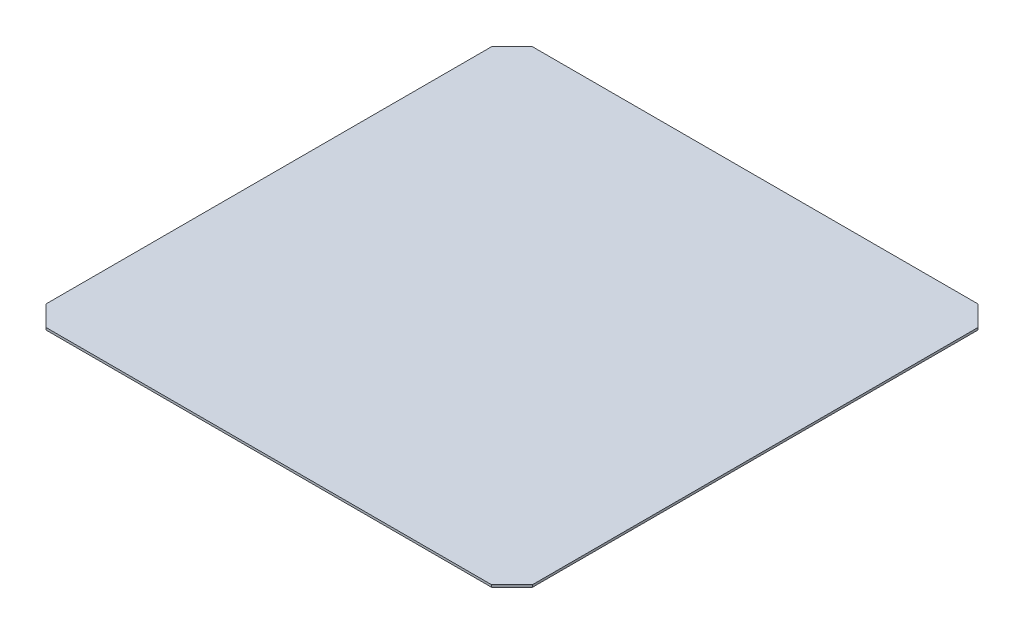
ISO-10303-21;
HEADER;
FILE_DESCRIPTION(('STEP AP214'),'2;1');
FILE_NAME('part.step','',(''),(''),'','','');
FILE_SCHEMA(('AUTOMOTIVE_DESIGN { 1 0 10303 214 1 1 1 1 }'));
ENDSEC;
DATA;
#1=APPLICATION_CONTEXT('core data for automotive mechanical design processes');
#2=APPLICATION_PROTOCOL_DEFINITION('international standard','automotive_design',2000,#1);
#3=PRODUCT_CONTEXT('',#1,'mechanical');
#4=PRODUCT('Part','Part','',(#3));
#5=PRODUCT_RELATED_PRODUCT_CATEGORY('part','',(#4));
#6=PRODUCT_DEFINITION_FORMATION('','',#4);
#7=PRODUCT_DEFINITION_CONTEXT('part definition',#1,'design');
#8=PRODUCT_DEFINITION('design','',#6,#7);
#9=PRODUCT_DEFINITION_SHAPE('','',#8);
#10=(LENGTH_UNIT() NAMED_UNIT(*) SI_UNIT(.MILLI.,.METRE.));
#11=(NAMED_UNIT(*) PLANE_ANGLE_UNIT() SI_UNIT($,.RADIAN.));
#12=(NAMED_UNIT(*) SI_UNIT($,.STERADIAN.) SOLID_ANGLE_UNIT());
#13=UNCERTAINTY_MEASURE_WITH_UNIT(LENGTH_MEASURE(1.E-05),#10,'distance_accuracy_value','');
#14=(GEOMETRIC_REPRESENTATION_CONTEXT(3) GLOBAL_UNCERTAINTY_ASSIGNED_CONTEXT((#13)) GLOBAL_UNIT_ASSIGNED_CONTEXT((#10,
#11,#12)) REPRESENTATION_CONTEXT('',''));
#15=CARTESIAN_POINT('',(0.,0.,0.));
#16=DIRECTION('',(0.,0.,1.));
#17=DIRECTION('',(1.,0.,0.));
#18=AXIS2_PLACEMENT_3D('',#15,#16,#17);
#19=CARTESIAN_POINT('',(191.936218840519,159.973467120901,354.11857786968));
#20=DIRECTION('',(0.,0.,-1.));
#21=DIRECTION('',(-1.,0.,0.));
#22=AXIS2_PLACEMENT_3D('',#19,#20,#21);
#23=PLANE('',#22);
#24=DIRECTION('',(1.,0.,0.));
#25=VECTOR('',#24,1.);
#26=CARTESIAN_POINT('',(191.936218840519,158.973467120901,354.11857786968));
#27=LINE('',#26,#25);
#28=CARTESIAN_POINT('',(-8.06378115948106,158.973467120901,354.11857786968));
#29=VERTEX_POINT('',#28);
#30=CARTESIAN_POINT('',(188.936218840519,158.973467120901,354.11857786968));
#31=VERTEX_POINT('',#30);
#32=EDGE_CURVE('E131',#29,#31,#27,.T.);
#33=ORIENTED_EDGE('',*,*,#32,.T.);
#34=DIRECTION('',(0.,1.,0.));
#35=VECTOR('',#34,1.);
#36=CARTESIAN_POINT('',(188.936218840519,159.973467120901,354.11857786968));
#37=LINE('',#36,#35);
#38=CARTESIAN_POINT('',(188.936218840519,159.973467120901,354.11857786968));
#39=VERTEX_POINT('',#38);
#40=EDGE_CURVE('E154',#31,#39,#37,.T.);
#41=ORIENTED_EDGE('',*,*,#40,.T.);
#42=DIRECTION('',(1.,0.,0.));
#43=VECTOR('',#42,1.);
#44=CARTESIAN_POINT('',(-17.0637811594811,159.973467120901,354.11857786968));
#45=LINE('',#44,#43);
#46=CARTESIAN_POINT('',(-8.06378115948106,159.973467120901,354.11857786968));
#47=VERTEX_POINT('',#46);
#48=EDGE_CURVE('E129',#47,#39,#45,.T.);
#49=ORIENTED_EDGE('',*,*,#48,.F.);
#50=DIRECTION('',(0.,-1.,0.));
#51=VECTOR('',#50,1.);
#52=CARTESIAN_POINT('',(-8.06378115948106,159.973467120901,354.11857786968));
#53=LINE('',#52,#51);
#54=EDGE_CURVE('E151',#47,#29,#53,.T.);
#55=ORIENTED_EDGE('',*,*,#54,.T.);
#56=EDGE_LOOP('',(#33,#41,#49,#55));
#57=FACE_BOUND('',#56,.T.);
#58=ADVANCED_FACE('F35',(#57),#23,.F.);
#59=CARTESIAN_POINT('',(197.936218840519,159.973467120901,139.11857786968));
#60=DIRECTION('',(-1.,0.,0.));
#61=DIRECTION('',(0.,0.,1.));
#62=AXIS2_PLACEMENT_3D('',#59,#60,#61);
#63=PLANE('',#62);
#64=DIRECTION('',(0.,0.,-1.));
#65=VECTOR('',#64,1.);
#66=CARTESIAN_POINT('',(197.936218840519,158.973467120901,139.11857786968));
#67=LINE('',#66,#65);
#68=CARTESIAN_POINT('',(197.936218840519,158.973467120901,345.11857786968));
#69=VERTEX_POINT('',#68);
#70=CARTESIAN_POINT('',(197.936218840519,158.973467120901,148.11857786968));
#71=VERTEX_POINT('',#70);
#72=EDGE_CURVE('E127',#69,#71,#67,.T.);
#73=ORIENTED_EDGE('',*,*,#72,.T.);
#74=DIRECTION('',(0.,1.,0.));
#75=VECTOR('',#74,1.);
#76=CARTESIAN_POINT('',(197.936218840519,159.973467120901,148.11857786968));
#77=LINE('',#76,#75);
#78=CARTESIAN_POINT('',(197.936218840519,159.973467120901,148.11857786968));
#79=VERTEX_POINT('',#78);
#80=EDGE_CURVE('E106',#71,#79,#77,.T.);
#81=ORIENTED_EDGE('',*,*,#80,.T.);
#82=DIRECTION('',(0.,0.,-1.));
#83=VECTOR('',#82,1.);
#84=CARTESIAN_POINT('',(197.936218840519,159.973467120901,354.11857786968));
#85=LINE('',#84,#83);
#86=CARTESIAN_POINT('',(197.936218840519,159.973467120901,345.11857786968));
#87=VERTEX_POINT('',#86);
#88=EDGE_CURVE('E170',#87,#79,#85,.T.);
#89=ORIENTED_EDGE('',*,*,#88,.F.);
#90=DIRECTION('',(0.,-1.,0.));
#91=VECTOR('',#90,1.);
#92=CARTESIAN_POINT('',(197.936218840519,159.973467120901,345.11857786968));
#93=LINE('',#92,#91);
#94=EDGE_CURVE('E111',#87,#69,#93,.T.);
#95=ORIENTED_EDGE('',*,*,#94,.T.);
#96=EDGE_LOOP('',(#73,#81,#89,#95));
#97=FACE_BOUND('',#96,.T.);
#98=ADVANCED_FACE('F187',(#97),#63,.F.);
#99=CARTESIAN_POINT('',(-11.0637811594811,159.973467120901,139.11857786968));
#100=DIRECTION('',(0.,0.,1.));
#101=DIRECTION('',(1.,0.,0.));
#102=AXIS2_PLACEMENT_3D('',#99,#100,#101);
#103=PLANE('',#102);
#104=DIRECTION('',(-1.,0.,0.));
#105=VECTOR('',#104,1.);
#106=CARTESIAN_POINT('',(191.936218840519,159.973467120901,139.11857786968));
#107=LINE('',#106,#105);
#108=CARTESIAN_POINT('',(188.936218840519,159.973467120901,139.11857786968));
#109=VERTEX_POINT('',#108);
#110=CARTESIAN_POINT('',(-8.06378115948106,159.973467120901,139.11857786968));
#111=VERTEX_POINT('',#110);
#112=EDGE_CURVE('E120',#109,#111,#107,.T.);
#113=ORIENTED_EDGE('',*,*,#112,.F.);
#114=DIRECTION('',(0.,-1.,0.));
#115=VECTOR('',#114,1.);
#116=CARTESIAN_POINT('',(188.936218840519,159.973467120901,139.11857786968));
#117=LINE('',#116,#115);
#118=CARTESIAN_POINT('',(188.936218840519,158.973467120901,139.11857786968));
#119=VERTEX_POINT('',#118);
#120=EDGE_CURVE('E105',#109,#119,#117,.T.);
#121=ORIENTED_EDGE('',*,*,#120,.T.);
#122=DIRECTION('',(-1.,0.,0.));
#123=VECTOR('',#122,1.);
#124=CARTESIAN_POINT('',(-11.0637811594811,158.973467120901,139.11857786968));
#125=LINE('',#124,#123);
#126=CARTESIAN_POINT('',(-8.06378115948106,158.973467120901,139.11857786968));
#127=VERTEX_POINT('',#126);
#128=EDGE_CURVE('E118',#119,#127,#125,.T.);
#129=ORIENTED_EDGE('',*,*,#128,.T.);
#130=DIRECTION('',(0.,1.,0.));
#131=VECTOR('',#130,1.);
#132=CARTESIAN_POINT('',(-8.06378115948106,159.973467120901,139.11857786968));
#133=LINE('',#132,#131);
#134=EDGE_CURVE('E122',#127,#111,#133,.T.);
#135=ORIENTED_EDGE('',*,*,#134,.T.);
#136=EDGE_LOOP('',(#113,#121,#129,#135));
#137=FACE_BOUND('',#136,.T.);
#138=ADVANCED_FACE('F117',(#137),#103,.F.);
#139=CARTESIAN_POINT('',(-17.0637811594811,159.973467120901,348.11857786968));
#140=DIRECTION('',(1.,0.,0.));
#141=DIRECTION('',(0.,0.,-1.));
#142=AXIS2_PLACEMENT_3D('',#139,#140,#141);
#143=PLANE('',#142);
#144=DIRECTION('',(0.,0.,1.));
#145=VECTOR('',#144,1.);
#146=CARTESIAN_POINT('',(-17.0637811594811,158.973467120901,348.11857786968));
#147=LINE('',#146,#145);
#148=CARTESIAN_POINT('',(-17.0637811594811,158.973467120901,148.11857786968));
#149=VERTEX_POINT('',#148);
#150=CARTESIAN_POINT('',(-17.0637811594811,158.973467120901,345.11857786968));
#151=VERTEX_POINT('',#150);
#152=EDGE_CURVE('E126',#149,#151,#147,.T.);
#153=ORIENTED_EDGE('',*,*,#152,.T.);
#154=DIRECTION('',(0.,1.,0.));
#155=VECTOR('',#154,1.);
#156=CARTESIAN_POINT('',(-17.0637811594811,159.973467120901,345.11857786968));
#157=LINE('',#156,#155);
#158=CARTESIAN_POINT('',(-17.0637811594811,159.973467120901,345.11857786968));
#159=VERTEX_POINT('',#158);
#160=EDGE_CURVE('E11',#151,#159,#157,.T.);
#161=ORIENTED_EDGE('',*,*,#160,.T.);
#162=DIRECTION('',(0.,0.,1.));
#163=VECTOR('',#162,1.);
#164=CARTESIAN_POINT('',(-17.0637811594811,159.973467120901,139.11857786968));
#165=LINE('',#164,#163);
#166=CARTESIAN_POINT('',(-17.0637811594811,159.973467120901,148.11857786968));
#167=VERTEX_POINT('',#166);
#168=EDGE_CURVE('E135',#167,#159,#165,.T.);
#169=ORIENTED_EDGE('',*,*,#168,.F.);
#170=DIRECTION('',(0.,-1.,0.));
#171=VECTOR('',#170,1.);
#172=CARTESIAN_POINT('',(-17.0637811594811,159.973467120901,148.11857786968));
#173=LINE('',#172,#171);
#174=EDGE_CURVE('E44',#167,#149,#173,.T.);
#175=ORIENTED_EDGE('',*,*,#174,.T.);
#176=EDGE_LOOP('',(#153,#161,#169,#175));
#177=FACE_BOUND('',#176,.T.);
#178=ADVANCED_FACE('F157',(#177),#143,.F.);
#179=CARTESIAN_POINT('',(0.,159.973467120901,0.));
#180=DIRECTION('',(0.,1.,0.));
#181=DIRECTION('',(0.,0.,1.));
#182=AXIS2_PLACEMENT_3D('',#179,#180,#181);
#183=PLANE('',#182);
#184=ORIENTED_EDGE('',*,*,#88,.T.);
#185=DIRECTION('',(0.707106781186546,0.,0.707106781186549));
#186=VECTOR('',#185,1.);
#187=CARTESIAN_POINT('',(24.9088204854196,159.973467120901,-24.9088204854195));
#188=LINE('',#187,#186);
#189=EDGE_CURVE('E149',#79,#109,#188,.F.);
#190=ORIENTED_EDGE('',*,*,#189,.T.);
#191=ORIENTED_EDGE('',*,*,#112,.T.);
#192=DIRECTION('',(0.707106781186549,0.,-0.707106781186546));
#193=VECTOR('',#192,1.);
#194=CARTESIAN_POINT('',(65.5273983550996,159.973467120901,65.5273983550998));
#195=LINE('',#194,#193);
#196=EDGE_CURVE('E56',#111,#167,#195,.F.);
#197=ORIENTED_EDGE('',*,*,#196,.T.);
#198=ORIENTED_EDGE('',*,*,#168,.T.);
#199=DIRECTION('',(-0.707106781186544,0.,-0.707106781186551));
#200=VECTOR('',#199,1.);
#201=CARTESIAN_POINT('',(-181.091179514581,159.973467120901,181.091179514579));
#202=LINE('',#201,#200);
#203=EDGE_CURVE('E145',#159,#47,#202,.F.);
#204=ORIENTED_EDGE('',*,*,#203,.T.);
#205=ORIENTED_EDGE('',*,*,#48,.T.);
#206=DIRECTION('',(-0.707106781186552,0.,0.707106781186543));
#207=VECTOR('',#206,1.);
#208=CARTESIAN_POINT('',(271.527398355098,159.973467120901,271.527398355102));
#209=LINE('',#208,#207);
#210=EDGE_CURVE('E147',#39,#87,#209,.F.);
#211=ORIENTED_EDGE('',*,*,#210,.T.);
#212=EDGE_LOOP('',(#184,#190,#191,#197,#198,#204,#205,#211));
#213=FACE_BOUND('',#212,.T.);
#214=ADVANCED_FACE('F176',(#213),#183,.T.);
#215=CARTESIAN_POINT('',(0.,158.973467120901,0.));
#216=DIRECTION('',(0.,1.,0.));
#217=DIRECTION('',(0.,0.,1.));
#218=AXIS2_PLACEMENT_3D('',#215,#216,#217);
#219=PLANE('',#218);
#220=ORIENTED_EDGE('',*,*,#128,.F.);
#221=DIRECTION('',(-0.707106781186546,0.,-0.707106781186549));
#222=VECTOR('',#221,1.);
#223=CARTESIAN_POINT('',(188.936218840519,158.973467120901,139.11857786968));
#224=LINE('',#223,#222);
#225=EDGE_CURVE('E101',#119,#71,#224,.F.);
#226=ORIENTED_EDGE('',*,*,#225,.T.);
#227=ORIENTED_EDGE('',*,*,#72,.F.);
#228=DIRECTION('',(0.707106781186552,0.,-0.707106781186543));
#229=VECTOR('',#228,1.);
#230=CARTESIAN_POINT('',(197.936218840519,158.973467120901,345.11857786968));
#231=LINE('',#230,#229);
#232=EDGE_CURVE('E112',#69,#31,#231,.F.);
#233=ORIENTED_EDGE('',*,*,#232,.T.);
#234=ORIENTED_EDGE('',*,*,#32,.F.);
#235=DIRECTION('',(0.707106781186544,0.,0.707106781186551));
#236=VECTOR('',#235,1.);
#237=CARTESIAN_POINT('',(-8.06378115948106,158.973467120901,354.11857786968));
#238=LINE('',#237,#236);
#239=EDGE_CURVE('E138',#29,#151,#238,.F.);
#240=ORIENTED_EDGE('',*,*,#239,.T.);
#241=ORIENTED_EDGE('',*,*,#152,.F.);
#242=DIRECTION('',(-0.707106781186549,0.,0.707106781186546));
#243=VECTOR('',#242,1.);
#244=CARTESIAN_POINT('',(-17.0637811594811,158.973467120901,148.11857786968));
#245=LINE('',#244,#243);
#246=EDGE_CURVE('E121',#149,#127,#245,.F.);
#247=ORIENTED_EDGE('',*,*,#246,.T.);
#248=EDGE_LOOP('',(#220,#226,#227,#233,#234,#240,#241,#247));
#249=FACE_BOUND('',#248,.T.);
#250=ADVANCED_FACE('F124',(#249),#219,.F.);
#251=CARTESIAN_POINT('',(188.936218840519,159.973467120901,139.11857786968));
#252=DIRECTION('',(-0.707106781186549,0.,0.707106781186546));
#253=DIRECTION('',(0.,-1.,0.));
#254=AXIS2_PLACEMENT_3D('',#251,#252,#253);
#255=PLANE('',#254);
#256=ORIENTED_EDGE('',*,*,#189,.F.);
#257=ORIENTED_EDGE('',*,*,#80,.F.);
#258=ORIENTED_EDGE('',*,*,#225,.F.);
#259=ORIENTED_EDGE('',*,*,#120,.F.);
#260=EDGE_LOOP('',(#256,#257,#258,#259));
#261=FACE_BOUND('',#260,.T.);
#262=ADVANCED_FACE('F104',(#261),#255,.F.);
#263=CARTESIAN_POINT('',(197.936218840519,159.973467120901,345.11857786968));
#264=DIRECTION('',(-0.707106781186543,0.,-0.707106781186552));
#265=DIRECTION('',(0.,-1.,0.));
#266=AXIS2_PLACEMENT_3D('',#263,#264,#265);
#267=PLANE('',#266);
#268=ORIENTED_EDGE('',*,*,#210,.F.);
#269=ORIENTED_EDGE('',*,*,#40,.F.);
#270=ORIENTED_EDGE('',*,*,#232,.F.);
#271=ORIENTED_EDGE('',*,*,#94,.F.);
#272=EDGE_LOOP('',(#268,#269,#270,#271));
#273=FACE_BOUND('',#272,.T.);
#274=ADVANCED_FACE('F202',(#273),#267,.F.);
#275=CARTESIAN_POINT('',(-8.06378115948106,159.973467120901,354.11857786968));
#276=DIRECTION('',(0.707106781186551,0.,-0.707106781186544));
#277=DIRECTION('',(0.,-1.,0.));
#278=AXIS2_PLACEMENT_3D('',#275,#276,#277);
#279=PLANE('',#278);
#280=ORIENTED_EDGE('',*,*,#203,.F.);
#281=ORIENTED_EDGE('',*,*,#160,.F.);
#282=ORIENTED_EDGE('',*,*,#239,.F.);
#283=ORIENTED_EDGE('',*,*,#54,.F.);
#284=EDGE_LOOP('',(#280,#281,#282,#283));
#285=FACE_BOUND('',#284,.T.);
#286=ADVANCED_FACE('F164',(#285),#279,.F.);
#287=CARTESIAN_POINT('',(-17.0637811594811,159.973467120901,148.11857786968));
#288=DIRECTION('',(0.707106781186546,0.,0.707106781186549));
#289=DIRECTION('',(0.,-1.,0.));
#290=AXIS2_PLACEMENT_3D('',#287,#288,#289);
#291=PLANE('',#290);
#292=ORIENTED_EDGE('',*,*,#196,.F.);
#293=ORIENTED_EDGE('',*,*,#134,.F.);
#294=ORIENTED_EDGE('',*,*,#246,.F.);
#295=ORIENTED_EDGE('',*,*,#174,.F.);
#296=EDGE_LOOP('',(#292,#293,#294,#295));
#297=FACE_BOUND('',#296,.T.);
#298=ADVANCED_FACE('F38',(#297),#291,.F.);
#299=CLOSED_SHELL('',(#58,#98,#138,#178,#214,#250,#262,#274,#286,#298));
#300=MANIFOLD_SOLID_BREP('B2',#299);
#301=ADVANCED_BREP_SHAPE_REPRESENTATION('',(#18,#300),#14);
#302=SHAPE_DEFINITION_REPRESENTATION(#9,#301);
ENDSEC;
END-ISO-10303-21;
